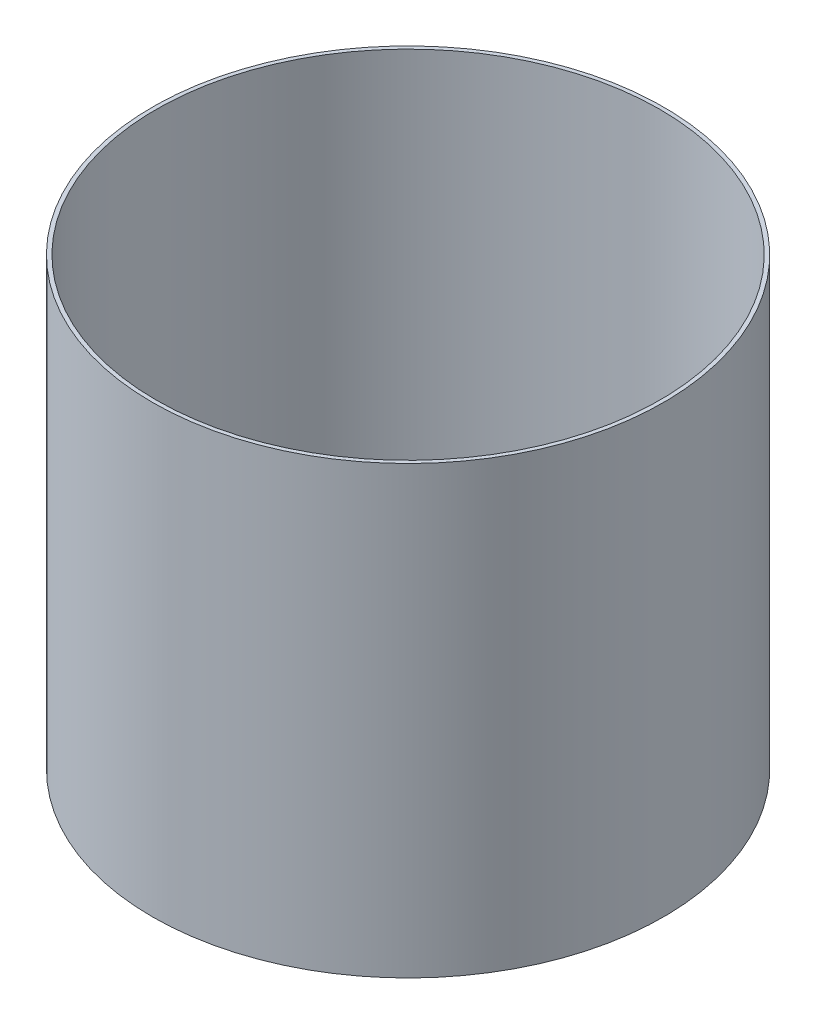
ISO-10303-21;
HEADER;
FILE_DESCRIPTION(('STEP AP214'),'2;1');
FILE_NAME('part.step','',(''),(''),'','','');
FILE_SCHEMA(('AUTOMOTIVE_DESIGN { 1 0 10303 214 1 1 1 1 }'));
ENDSEC;
DATA;
#1=APPLICATION_CONTEXT('core data for automotive mechanical design processes');
#2=APPLICATION_PROTOCOL_DEFINITION('international standard','automotive_design',2000,#1);
#3=PRODUCT_CONTEXT('',#1,'mechanical');
#4=PRODUCT('Part','Part','',(#3));
#5=PRODUCT_RELATED_PRODUCT_CATEGORY('part','',(#4));
#6=PRODUCT_DEFINITION_FORMATION('','',#4);
#7=PRODUCT_DEFINITION_CONTEXT('part definition',#1,'design');
#8=PRODUCT_DEFINITION('design','',#6,#7);
#9=PRODUCT_DEFINITION_SHAPE('','',#8);
#10=(LENGTH_UNIT() NAMED_UNIT(*) SI_UNIT(.MILLI.,.METRE.));
#11=(NAMED_UNIT(*) PLANE_ANGLE_UNIT() SI_UNIT($,.RADIAN.));
#12=(NAMED_UNIT(*) SI_UNIT($,.STERADIAN.) SOLID_ANGLE_UNIT());
#13=UNCERTAINTY_MEASURE_WITH_UNIT(LENGTH_MEASURE(1.E-05),#10,'distance_accuracy_value','');
#14=(GEOMETRIC_REPRESENTATION_CONTEXT(3) GLOBAL_UNCERTAINTY_ASSIGNED_CONTEXT((#13)) GLOBAL_UNIT_ASSIGNED_CONTEXT((#10,
#11,#12)) REPRESENTATION_CONTEXT('',''));
#15=CARTESIAN_POINT('',(0.,0.,0.));
#16=DIRECTION('',(0.,0.,1.));
#17=DIRECTION('',(1.,0.,0.));
#18=AXIS2_PLACEMENT_3D('',#15,#16,#17);
#19=CARTESIAN_POINT('',(0.,584.2,0.));
#20=DIRECTION('',(0.,-1.,0.));
#21=DIRECTION('',(0.,0.,-1.));
#22=AXIS2_PLACEMENT_3D('',#19,#20,#21);
#23=CYLINDRICAL_SURFACE('',#22,335.280000000028);
#24=CARTESIAN_POINT('',(0.,584.2,0.));
#25=DIRECTION('',(0.,1.,0.));
#26=DIRECTION('',(0.,0.,1.));
#27=AXIS2_PLACEMENT_3D('',#24,#25,#26);
#28=CIRCLE('',#27,335.280000000028);
#29=CARTESIAN_POINT('',(0.,584.2,335.280000000028));
#30=VERTEX_POINT('',#29);
#31=EDGE_CURVE('E10',#30,#30,#28,.T.);
#32=ORIENTED_EDGE('',*,*,#31,.F.);
#33=EDGE_LOOP('',(#32));
#34=FACE_BOUND('',#33,.T.);
#35=CARTESIAN_POINT('',(0.,0.,0.));
#36=DIRECTION('',(0.,1.,0.));
#37=DIRECTION('',(0.,0.,1.));
#38=AXIS2_PLACEMENT_3D('',#35,#36,#37);
#39=CIRCLE('',#38,335.280000000028);
#40=CARTESIAN_POINT('',(0.,0.,335.280000000028));
#41=VERTEX_POINT('',#40);
#42=EDGE_CURVE('E37',#41,#41,#39,.T.);
#43=ORIENTED_EDGE('',*,*,#42,.T.);
#44=EDGE_LOOP('',(#43));
#45=FACE_BOUND('',#44,.T.);
#46=ADVANCED_FACE('F34',(#34,#45),#23,.T.);
#47=CARTESIAN_POINT('',(0.,584.2,0.));
#48=DIRECTION('',(0.,1.,0.));
#49=DIRECTION('',(0.,0.,1.));
#50=AXIS2_PLACEMENT_3D('',#47,#48,#49);
#51=PLANE('',#50);
#52=CARTESIAN_POINT('',(0.,584.2,0.));
#53=DIRECTION('',(0.,1.,0.));
#54=DIRECTION('',(0.,0.,1.));
#55=AXIS2_PLACEMENT_3D('',#52,#53,#54);
#56=CIRCLE('',#55,330.2);
#57=CARTESIAN_POINT('',(0.,584.2,330.2));
#58=VERTEX_POINT('',#57);
#59=EDGE_CURVE('E46',#58,#58,#56,.T.);
#60=ORIENTED_EDGE('',*,*,#59,.F.);
#61=EDGE_LOOP('',(#60));
#62=FACE_BOUND('',#61,.T.);
#63=ORIENTED_EDGE('',*,*,#31,.T.);
#64=EDGE_LOOP('',(#63));
#65=FACE_BOUND('',#64,.T.);
#66=ADVANCED_FACE('F61',(#62,#65),#51,.T.);
#67=CARTESIAN_POINT('',(0.,0.,0.));
#68=DIRECTION('',(0.,1.,0.));
#69=DIRECTION('',(0.,0.,1.));
#70=AXIS2_PLACEMENT_3D('',#67,#68,#69);
#71=PLANE('',#70);
#72=ORIENTED_EDGE('',*,*,#42,.F.);
#73=EDGE_LOOP('',(#72));
#74=FACE_BOUND('',#73,.T.);
#75=ADVANCED_FACE('F57',(#74),#71,.F.);
#76=CARTESIAN_POINT('',(0.,25.4,0.));
#77=DIRECTION('',(0.,1.,0.));
#78=DIRECTION('',(0.,0.,1.));
#79=AXIS2_PLACEMENT_3D('',#76,#77,#78);
#80=CYLINDRICAL_SURFACE('',#79,330.2);
#81=CARTESIAN_POINT('',(0.,25.4,0.));
#82=DIRECTION('',(0.,1.,0.));
#83=DIRECTION('',(0.,0.,1.));
#84=AXIS2_PLACEMENT_3D('',#81,#82,#83);
#85=CIRCLE('',#84,330.2);
#86=CARTESIAN_POINT('',(0.,25.4,330.2));
#87=VERTEX_POINT('',#86);
#88=EDGE_CURVE('E44',#87,#87,#85,.T.);
#89=ORIENTED_EDGE('',*,*,#88,.F.);
#90=EDGE_LOOP('',(#89));
#91=FACE_BOUND('',#90,.T.);
#92=ORIENTED_EDGE('',*,*,#59,.T.);
#93=EDGE_LOOP('',(#92));
#94=FACE_BOUND('',#93,.T.);
#95=ADVANCED_FACE('F54',(#91,#94),#80,.F.);
#96=CARTESIAN_POINT('',(0.,25.4,0.));
#97=DIRECTION('',(0.,1.,0.));
#98=DIRECTION('',(0.,0.,1.));
#99=AXIS2_PLACEMENT_3D('',#96,#97,#98);
#100=PLANE('',#99);
#101=ORIENTED_EDGE('',*,*,#88,.T.);
#102=EDGE_LOOP('',(#101));
#103=FACE_BOUND('',#102,.T.);
#104=ADVANCED_FACE('F52',(#103),#100,.T.);
#105=CLOSED_SHELL('',(#46,#66,#75,#95,#104));
#106=MANIFOLD_SOLID_BREP('B2',#105);
#107=ADVANCED_BREP_SHAPE_REPRESENTATION('',(#18,#106),#14);
#108=SHAPE_DEFINITION_REPRESENTATION(#9,#107);
ENDSEC;
END-ISO-10303-21;
